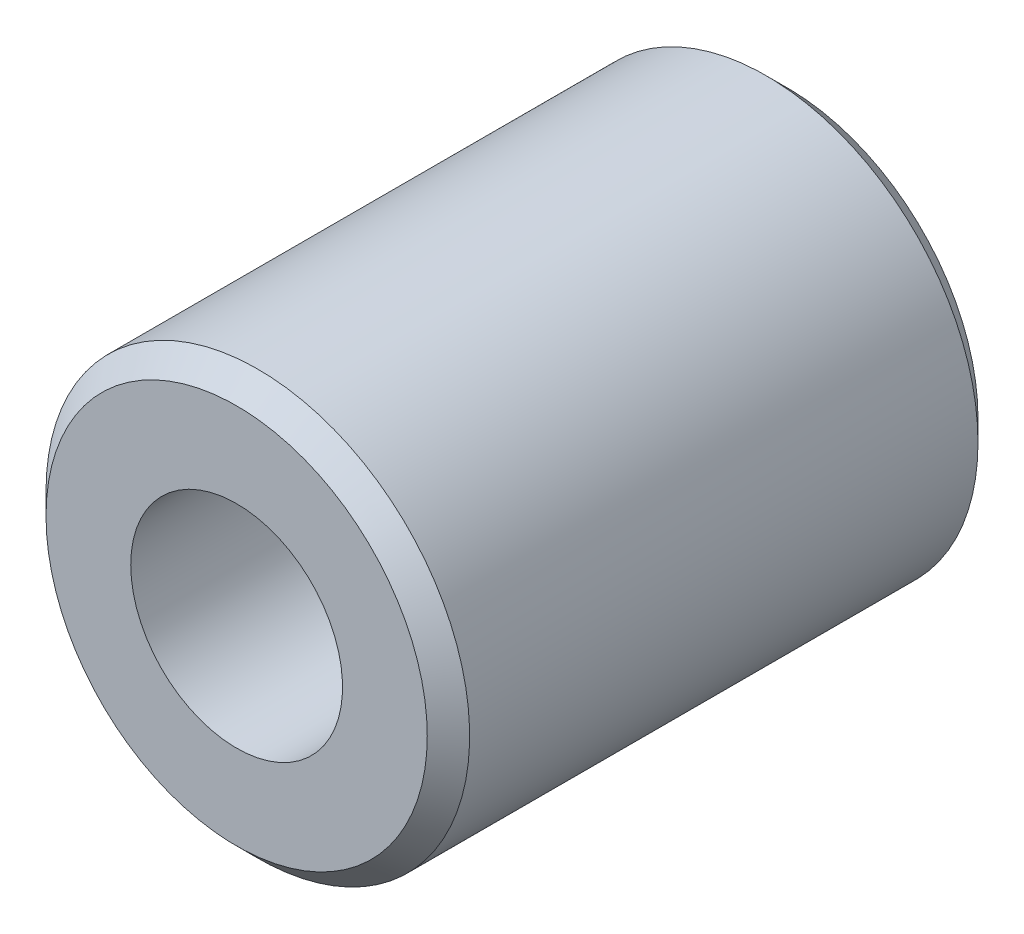
ISO-10303-21;
HEADER;
FILE_DESCRIPTION(('STEP AP214'),'2;1');
FILE_NAME('part.step','',(''),(''),'','','');
FILE_SCHEMA(('AUTOMOTIVE_DESIGN { 1 0 10303 214 1 1 1 1 }'));
ENDSEC;
DATA;
#1=APPLICATION_CONTEXT('core data for automotive mechanical design processes');
#2=APPLICATION_PROTOCOL_DEFINITION('international standard','automotive_design',2000,#1);
#3=PRODUCT_CONTEXT('',#1,'mechanical');
#4=PRODUCT('Part','Part','',(#3));
#5=PRODUCT_RELATED_PRODUCT_CATEGORY('part','',(#4));
#6=PRODUCT_DEFINITION_FORMATION('','',#4);
#7=PRODUCT_DEFINITION_CONTEXT('part definition',#1,'design');
#8=PRODUCT_DEFINITION('design','',#6,#7);
#9=PRODUCT_DEFINITION_SHAPE('','',#8);
#10=(LENGTH_UNIT() NAMED_UNIT(*) SI_UNIT(.MILLI.,.METRE.));
#11=(NAMED_UNIT(*) PLANE_ANGLE_UNIT() SI_UNIT($,.RADIAN.));
#12=(NAMED_UNIT(*) SI_UNIT($,.STERADIAN.) SOLID_ANGLE_UNIT());
#13=UNCERTAINTY_MEASURE_WITH_UNIT(LENGTH_MEASURE(1.E-05),#10,'distance_accuracy_value','');
#14=(GEOMETRIC_REPRESENTATION_CONTEXT(3) GLOBAL_UNCERTAINTY_ASSIGNED_CONTEXT((#13)) GLOBAL_UNIT_ASSIGNED_CONTEXT((#10,
#11,#12)) REPRESENTATION_CONTEXT('',''));
#15=CARTESIAN_POINT('',(0.,0.,0.));
#16=DIRECTION('',(0.,0.,1.));
#17=DIRECTION('',(1.,0.,0.));
#18=AXIS2_PLACEMENT_3D('',#15,#16,#17);
#19=CARTESIAN_POINT('',(0.,0.,13.));
#20=DIRECTION('',(0.,0.,1.));
#21=DIRECTION('',(1.,0.,0.));
#22=AXIS2_PLACEMENT_3D('',#19,#20,#21);
#23=PLANE('',#22);
#24=CARTESIAN_POINT('',(0.,0.,13.));
#25=DIRECTION('',(0.,0.,1.));
#26=DIRECTION('',(1.,0.,0.));
#27=AXIS2_PLACEMENT_3D('',#24,#25,#26);
#28=CIRCLE('',#27,4.50000000000001);
#29=CARTESIAN_POINT('',(4.50000000000001,0.,13.));
#30=VERTEX_POINT('',#29);
#31=EDGE_CURVE('E10',#30,#30,#28,.T.);
#32=ORIENTED_EDGE('',*,*,#31,.T.);
#33=EDGE_LOOP('',(#32));
#34=FACE_BOUND('',#33,.T.);
#35=CARTESIAN_POINT('',(0.,0.,13.));
#36=DIRECTION('',(0.,0.,1.));
#37=DIRECTION('',(1.,0.,0.));
#38=AXIS2_PLACEMENT_3D('',#35,#36,#37);
#39=CIRCLE('',#38,2.5);
#40=CARTESIAN_POINT('',(-2.5,0.,13.));
#41=VERTEX_POINT('',#40);
#42=EDGE_CURVE('E55',#41,#41,#39,.T.);
#43=ORIENTED_EDGE('',*,*,#42,.F.);
#44=EDGE_LOOP('',(#43));
#45=FACE_BOUND('',#44,.T.);
#46=ADVANCED_FACE('F34',(#34,#45),#23,.T.);
#47=CARTESIAN_POINT('',(0.,0.,0.));
#48=DIRECTION('',(0.,0.,1.));
#49=DIRECTION('',(1.,0.,0.));
#50=AXIS2_PLACEMENT_3D('',#47,#48,#49);
#51=PLANE('',#50);
#52=CARTESIAN_POINT('',(0.,0.,0.));
#53=DIRECTION('',(0.,0.,1.));
#54=DIRECTION('',(1.,0.,0.));
#55=AXIS2_PLACEMENT_3D('',#52,#53,#54);
#56=CIRCLE('',#55,4.49999999999998);
#57=CARTESIAN_POINT('',(4.49999999999998,0.,0.));
#58=VERTEX_POINT('',#57);
#59=EDGE_CURVE('E42',#58,#58,#56,.F.);
#60=ORIENTED_EDGE('',*,*,#59,.T.);
#61=EDGE_LOOP('',(#60));
#62=FACE_BOUND('',#61,.T.);
#63=CARTESIAN_POINT('',(0.,0.,0.));
#64=DIRECTION('',(0.,0.,1.));
#65=DIRECTION('',(1.,0.,0.));
#66=AXIS2_PLACEMENT_3D('',#63,#64,#65);
#67=CIRCLE('',#66,2.5);
#68=CARTESIAN_POINT('',(-2.5,0.,0.));
#69=VERTEX_POINT('',#68);
#70=EDGE_CURVE('E56',#69,#69,#67,.T.);
#71=ORIENTED_EDGE('',*,*,#70,.T.);
#72=EDGE_LOOP('',(#71));
#73=FACE_BOUND('',#72,.T.);
#74=ADVANCED_FACE('F66',(#62,#73),#51,.F.);
#75=CARTESIAN_POINT('',(0.,0.,13.));
#76=DIRECTION('',(0.,0.,-1.));
#77=DIRECTION('',(-1.,0.,0.));
#78=AXIS2_PLACEMENT_3D('',#75,#76,#77);
#79=CYLINDRICAL_SURFACE('',#78,5.);
#80=CARTESIAN_POINT('',(0.,0.,0.500000000000013));
#81=DIRECTION('',(0.,0.,1.));
#82=DIRECTION('',(1.,0.,0.));
#83=AXIS2_PLACEMENT_3D('',#80,#81,#82);
#84=CIRCLE('',#83,5.);
#85=CARTESIAN_POINT('',(-5.,0.,0.500000000000011));
#86=VERTEX_POINT('',#85);
#87=EDGE_CURVE('E46',#86,#86,#84,.T.);
#88=CARTESIAN_POINT('',(0.,0.,12.5));
#89=DIRECTION('',(0.,0.,1.));
#90=DIRECTION('',(1.,0.,0.));
#91=AXIS2_PLACEMENT_3D('',#88,#89,#90);
#92=CIRCLE('',#91,5.);
#93=CARTESIAN_POINT('',(-5.,0.,12.5));
#94=VERTEX_POINT('',#93);
#95=EDGE_CURVE('E50',#94,#94,#92,.F.);
#96=CARTESIAN_POINT('',(-5.,0.,0.500000000000011));
#97=CARTESIAN_POINT('',(-5.,0.,0.625000000000011));
#98=CARTESIAN_POINT('',(-5.,0.,0.750000000000011));
#99=CARTESIAN_POINT('',(-5.,0.,1.00000000000001));
#100=CARTESIAN_POINT('',(-5.,0.,1.12500000000001));
#101=CARTESIAN_POINT('',(-5.,0.,1.37500000000001));
#102=CARTESIAN_POINT('',(-5.,0.,1.50000000000001));
#103=CARTESIAN_POINT('',(-5.,0.,1.75000000000001));
#104=CARTESIAN_POINT('',(-5.,0.,1.87500000000001));
#105=CARTESIAN_POINT('',(-5.,0.,2.12500000000001));
#106=CARTESIAN_POINT('',(-5.,0.,2.25000000000001));
#107=CARTESIAN_POINT('',(-5.,0.,2.50000000000001));
#108=CARTESIAN_POINT('',(-5.,0.,2.62500000000001));
#109=CARTESIAN_POINT('',(-5.,0.,2.87500000000001));
#110=CARTESIAN_POINT('',(-5.,0.,3.00000000000001));
#111=CARTESIAN_POINT('',(-5.,0.,3.25000000000001));
#112=CARTESIAN_POINT('',(-5.,0.,3.37500000000001));
#113=CARTESIAN_POINT('',(-5.,0.,3.62500000000001));
#114=CARTESIAN_POINT('',(-5.,0.,3.75000000000001));
#115=CARTESIAN_POINT('',(-5.,0.,4.00000000000001));
#116=CARTESIAN_POINT('',(-5.,0.,4.12500000000001));
#117=CARTESIAN_POINT('',(-5.,0.,4.37500000000001));
#118=CARTESIAN_POINT('',(-5.,0.,4.50000000000001));
#119=CARTESIAN_POINT('',(-5.,0.,4.75000000000001));
#120=CARTESIAN_POINT('',(-5.,0.,4.87500000000001));
#121=CARTESIAN_POINT('',(-5.,0.,5.12500000000001));
#122=CARTESIAN_POINT('',(-5.,0.,5.25000000000001));
#123=CARTESIAN_POINT('',(-5.,0.,5.50000000000001));
#124=CARTESIAN_POINT('',(-5.,0.,5.62500000000001));
#125=CARTESIAN_POINT('',(-5.,0.,5.87500000000001));
#126=CARTESIAN_POINT('',(-5.,0.,6.00000000000001));
#127=CARTESIAN_POINT('',(-5.,0.,6.25000000000001));
#128=CARTESIAN_POINT('',(-5.,0.,6.37500000000001));
#129=CARTESIAN_POINT('',(-5.,0.,6.62500000000001));
#130=CARTESIAN_POINT('',(-5.,0.,6.75000000000001));
#131=CARTESIAN_POINT('',(-5.,0.,7.00000000000001));
#132=CARTESIAN_POINT('',(-5.,0.,7.12500000000001));
#133=CARTESIAN_POINT('',(-5.,0.,7.37500000000001));
#134=CARTESIAN_POINT('',(-5.,0.,7.50000000000001));
#135=CARTESIAN_POINT('',(-5.,0.,7.75000000000001));
#136=CARTESIAN_POINT('',(-5.,0.,7.87500000000001));
#137=CARTESIAN_POINT('',(-5.,0.,8.12500000000001));
#138=CARTESIAN_POINT('',(-5.,0.,8.25000000000001));
#139=CARTESIAN_POINT('',(-5.,0.,8.50000000000001));
#140=CARTESIAN_POINT('',(-5.,0.,8.62500000000001));
#141=CARTESIAN_POINT('',(-5.,0.,8.87500000000001));
#142=CARTESIAN_POINT('',(-5.,0.,9.00000000000001));
#143=CARTESIAN_POINT('',(-5.,0.,9.25000000000001));
#144=CARTESIAN_POINT('',(-5.,0.,9.37500000000001));
#145=CARTESIAN_POINT('',(-5.,0.,9.62500000000001));
#146=CARTESIAN_POINT('',(-5.,0.,9.75000000000001));
#147=CARTESIAN_POINT('',(-5.,0.,10.));
#148=CARTESIAN_POINT('',(-5.,0.,10.125));
#149=CARTESIAN_POINT('',(-5.,0.,10.375));
#150=CARTESIAN_POINT('',(-5.,0.,10.5));
#151=CARTESIAN_POINT('',(-5.,0.,10.75));
#152=CARTESIAN_POINT('',(-5.,0.,10.875));
#153=CARTESIAN_POINT('',(-5.,0.,11.125));
#154=CARTESIAN_POINT('',(-5.,0.,11.25));
#155=CARTESIAN_POINT('',(-5.,0.,11.5));
#156=CARTESIAN_POINT('',(-5.,0.,11.625));
#157=CARTESIAN_POINT('',(-5.,0.,11.875));
#158=CARTESIAN_POINT('',(-5.,0.,12.));
#159=CARTESIAN_POINT('',(-5.,0.,12.25));
#160=CARTESIAN_POINT('',(-5.,0.,12.375));
#161=CARTESIAN_POINT('',(-5.,0.,12.5));
#162=B_SPLINE_CURVE_WITH_KNOTS('',3,(#96,#97,#98,#99,#100,#101,#102,#103,#104,#105,#106,#107,
#108,#109,#110,#111,#112,#113,#114,#115,#116,#117,#118,#119,#120,#121,#122,#123,#124,#125,#126,
#127,#128,#129,#130,#131,#132,#133,#134,#135,#136,#137,#138,#139,#140,#141,#142,#143,#144,#145,
#146,#147,#148,#149,#150,#151,#152,#153,#154,#155,#156,#157,#158,#159,#160,#161),.UNSPECIFIED.,
.F.,.F.,(4,2,2,2,2,2,2,2,2,2,2,2,2,2,2,2,2,2,2,2,2,2,2,2,2,2,2,2,2,2,2,2,4),(0.,0.375,
0.750000000000001,1.125,1.5,1.875,2.25,2.625,3.,3.375,3.75,4.125,4.5,4.875,5.25,5.625,6.,6.375,
6.75,7.125,7.5,7.875,8.25,8.625,9.,9.375,9.75,10.125,10.5,10.875,11.25,11.625,12.),.UNSPECIFIED.);
#163=EDGE_CURVE('BSEAM71',#86,#94,#162,.T.);
#164=ORIENTED_EDGE('',*,*,#87,.T.);
#165=ORIENTED_EDGE('',*,*,#95,.T.);
#166=ORIENTED_EDGE('',*,*,#163,.T.);
#167=ORIENTED_EDGE('',*,*,#163,.F.);
#168=EDGE_LOOP('',(#164,#166,#165,#167));
#169=FACE_BOUND('',#168,.T.);
#170=ADVANCED_FACE('F71',(#169),#79,.T.);
#171=CARTESIAN_POINT('',(0.,0.,13.));
#172=DIRECTION('',(0.,0.,-1.));
#173=DIRECTION('',(-1.,0.,0.));
#174=AXIS2_PLACEMENT_3D('',#171,#172,#173);
#175=CYLINDRICAL_SURFACE('',#174,2.5);
#176=CARTESIAN_POINT('',(-2.5,0.,13.));
#177=CARTESIAN_POINT('',(-2.5,0.,12.8645833333333));
#178=CARTESIAN_POINT('',(-2.5,0.,12.7291666666667));
#179=CARTESIAN_POINT('',(-2.5,0.,12.4583333333333));
#180=CARTESIAN_POINT('',(-2.5,0.,12.3229166666667));
#181=CARTESIAN_POINT('',(-2.5,0.,12.0520833333333));
#182=CARTESIAN_POINT('',(-2.5,0.,11.9166666666667));
#183=CARTESIAN_POINT('',(-2.5,0.,11.6458333333333));
#184=CARTESIAN_POINT('',(-2.5,0.,11.5104166666667));
#185=CARTESIAN_POINT('',(-2.5,0.,11.2395833333333));
#186=CARTESIAN_POINT('',(-2.5,0.,11.1041666666667));
#187=CARTESIAN_POINT('',(-2.5,0.,10.8333333333333));
#188=CARTESIAN_POINT('',(-2.5,0.,10.6979166666667));
#189=CARTESIAN_POINT('',(-2.5,0.,10.4270833333333));
#190=CARTESIAN_POINT('',(-2.5,0.,10.2916666666667));
#191=CARTESIAN_POINT('',(-2.5,0.,10.0208333333333));
#192=CARTESIAN_POINT('',(-2.5,0.,9.88541666666667));
#193=CARTESIAN_POINT('',(-2.5,0.,9.61458333333333));
#194=CARTESIAN_POINT('',(-2.5,0.,9.47916666666667));
#195=CARTESIAN_POINT('',(-2.5,0.,9.20833333333333));
#196=CARTESIAN_POINT('',(-2.5,0.,9.07291666666667));
#197=CARTESIAN_POINT('',(-2.5,0.,8.80208333333333));
#198=CARTESIAN_POINT('',(-2.5,0.,8.66666666666667));
#199=CARTESIAN_POINT('',(-2.5,0.,8.39583333333333));
#200=CARTESIAN_POINT('',(-2.5,0.,8.26041666666667));
#201=CARTESIAN_POINT('',(-2.5,0.,7.98958333333333));
#202=CARTESIAN_POINT('',(-2.5,0.,7.85416666666667));
#203=CARTESIAN_POINT('',(-2.5,0.,7.58333333333333));
#204=CARTESIAN_POINT('',(-2.5,0.,7.44791666666667));
#205=CARTESIAN_POINT('',(-2.5,0.,7.17708333333333));
#206=CARTESIAN_POINT('',(-2.5,0.,7.04166666666667));
#207=CARTESIAN_POINT('',(-2.5,0.,6.77083333333333));
#208=CARTESIAN_POINT('',(-2.5,0.,6.63541666666667));
#209=CARTESIAN_POINT('',(-2.5,0.,6.36458333333333));
#210=CARTESIAN_POINT('',(-2.5,0.,6.22916666666667));
#211=CARTESIAN_POINT('',(-2.5,0.,5.95833333333333));
#212=CARTESIAN_POINT('',(-2.5,0.,5.82291666666667));
#213=CARTESIAN_POINT('',(-2.5,0.,5.55208333333333));
#214=CARTESIAN_POINT('',(-2.5,0.,5.41666666666667));
#215=CARTESIAN_POINT('',(-2.5,0.,5.14583333333333));
#216=CARTESIAN_POINT('',(-2.5,0.,5.01041666666667));
#217=CARTESIAN_POINT('',(-2.5,0.,4.73958333333333));
#218=CARTESIAN_POINT('',(-2.5,0.,4.60416666666667));
#219=CARTESIAN_POINT('',(-2.5,0.,4.33333333333333));
#220=CARTESIAN_POINT('',(-2.5,0.,4.19791666666667));
#221=CARTESIAN_POINT('',(-2.5,0.,3.92708333333333));
#222=CARTESIAN_POINT('',(-2.5,0.,3.79166666666667));
#223=CARTESIAN_POINT('',(-2.5,0.,3.52083333333333));
#224=CARTESIAN_POINT('',(-2.5,0.,3.38541666666667));
#225=CARTESIAN_POINT('',(-2.5,0.,3.11458333333333));
#226=CARTESIAN_POINT('',(-2.5,0.,2.97916666666667));
#227=CARTESIAN_POINT('',(-2.5,0.,2.70833333333333));
#228=CARTESIAN_POINT('',(-2.5,0.,2.57291666666667));
#229=CARTESIAN_POINT('',(-2.5,0.,2.30208333333333));
#230=CARTESIAN_POINT('',(-2.5,0.,2.16666666666667));
#231=CARTESIAN_POINT('',(-2.5,0.,1.89583333333333));
#232=CARTESIAN_POINT('',(-2.5,0.,1.76041666666667));
#233=CARTESIAN_POINT('',(-2.5,0.,1.48958333333333));
#234=CARTESIAN_POINT('',(-2.5,0.,1.35416666666667));
#235=CARTESIAN_POINT('',(-2.5,0.,1.08333333333333));
#236=CARTESIAN_POINT('',(-2.5,0.,0.947916666666667));
#237=CARTESIAN_POINT('',(-2.5,0.,0.677083333333334));
#238=CARTESIAN_POINT('',(-2.5,0.,0.541666666666667));
#239=CARTESIAN_POINT('',(-2.5,0.,0.270833333333334));
#240=CARTESIAN_POINT('',(-2.5,0.,0.135416666666667));
#241=CARTESIAN_POINT('',(-2.5,0.,0.));
#242=B_SPLINE_CURVE_WITH_KNOTS('',3,(#176,#177,#178,#179,#180,#181,#182,#183,#184,#185,#186,
#187,#188,#189,#190,#191,#192,#193,#194,#195,#196,#197,#198,#199,#200,#201,#202,#203,#204,#205,
#206,#207,#208,#209,#210,#211,#212,#213,#214,#215,#216,#217,#218,#219,#220,#221,#222,#223,#224,
#225,#226,#227,#228,#229,#230,#231,#232,#233,#234,#235,#236,#237,#238,#239,#240,#241),
.UNSPECIFIED.,.F.,.F.,(4,2,2,2,2,2,2,2,2,2,2,2,2,2,2,2,2,2,2,2,2,2,2,2,2,2,2,2,2,2,2,2,4),(0.,
0.406249999999999,0.812499999999999,1.21875,1.625,2.03125,2.4375,2.84375,3.25,3.65625,4.0625,
4.46875,4.875,5.28125,5.6875,6.09375,6.5,6.90625,7.3125,7.71875,8.125,8.53125,8.9375,9.34375,
9.75,10.15625,10.5625,10.96875,11.375,11.78125,12.1875,12.59375,13.),.UNSPECIFIED.);
#243=EDGE_CURVE('BSEAM62',#41,#69,#242,.T.);
#244=ORIENTED_EDGE('',*,*,#42,.T.);
#245=ORIENTED_EDGE('',*,*,#70,.F.);
#246=ORIENTED_EDGE('',*,*,#243,.T.);
#247=ORIENTED_EDGE('',*,*,#243,.F.);
#248=EDGE_LOOP('',(#244,#246,#245,#247));
#249=FACE_BOUND('',#248,.T.);
#250=ADVANCED_FACE('F62',(#249),#175,.F.);
#251=CARTESIAN_POINT('',(0.,0.,0.500000000000013));
#252=DIRECTION('',(0.,0.,1.));
#253=DIRECTION('',(1.,0.,0.));
#254=AXIS2_PLACEMENT_3D('',#251,#252,#253);
#255=CONICAL_SURFACE('',#254,5.,0.785398163397453);
#256=ORIENTED_EDGE('',*,*,#59,.F.);
#257=EDGE_LOOP('',(#256));
#258=FACE_BOUND('',#257,.T.);
#259=ORIENTED_EDGE('',*,*,#87,.F.);
#260=EDGE_LOOP('',(#259));
#261=FACE_BOUND('',#260,.T.);
#262=ADVANCED_FACE('F78',(#258,#261),#255,.T.);
#263=CARTESIAN_POINT('',(0.,0.,13.));
#264=DIRECTION('',(0.,0.,-1.));
#265=DIRECTION('',(-1.,0.,0.));
#266=AXIS2_PLACEMENT_3D('',#263,#264,#265);
#267=CONICAL_SURFACE('',#266,4.50000000000001,0.785398163397444);
#268=ORIENTED_EDGE('',*,*,#95,.F.);
#269=EDGE_LOOP('',(#268));
#270=FACE_BOUND('',#269,.T.);
#271=ORIENTED_EDGE('',*,*,#31,.F.);
#272=EDGE_LOOP('',(#271));
#273=FACE_BOUND('',#272,.T.);
#274=ADVANCED_FACE('F37',(#270,#273),#267,.T.);
#275=CLOSED_SHELL('',(#46,#74,#170,#250,#262,#274));
#276=MANIFOLD_SOLID_BREP('B2',#275);
#277=ADVANCED_BREP_SHAPE_REPRESENTATION('',(#18,#276),#14);
#278=SHAPE_DEFINITION_REPRESENTATION(#9,#277);
ENDSEC;
END-ISO-10303-21;
